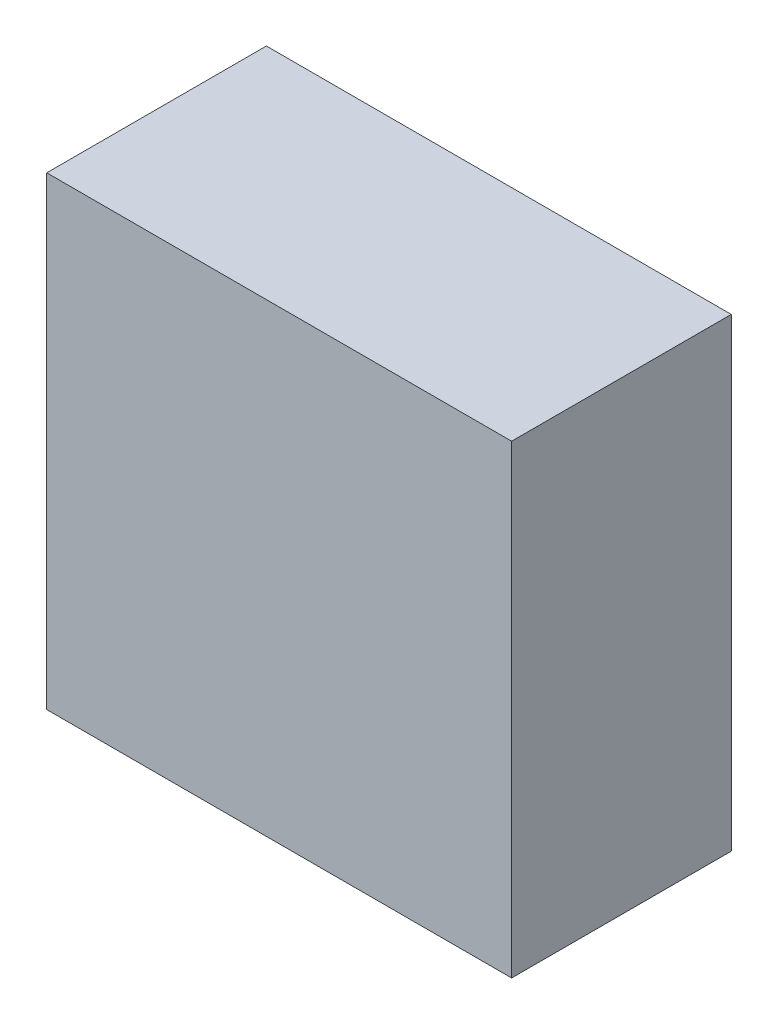
ISO-10303-21;
HEADER;
FILE_DESCRIPTION(('STEP AP214'),'2;1');
FILE_NAME('part.step','',(''),(''),'','','');
FILE_SCHEMA(('AUTOMOTIVE_DESIGN { 1 0 10303 214 1 1 1 1 }'));
ENDSEC;
DATA;
#1=APPLICATION_CONTEXT('core data for automotive mechanical design processes');
#2=APPLICATION_PROTOCOL_DEFINITION('international standard','automotive_design',2000,#1);
#3=PRODUCT_CONTEXT('',#1,'mechanical');
#4=PRODUCT('Part','Part','',(#3));
#5=PRODUCT_RELATED_PRODUCT_CATEGORY('part','',(#4));
#6=PRODUCT_DEFINITION_FORMATION('','',#4);
#7=PRODUCT_DEFINITION_CONTEXT('part definition',#1,'design');
#8=PRODUCT_DEFINITION('design','',#6,#7);
#9=PRODUCT_DEFINITION_SHAPE('','',#8);
#10=(LENGTH_UNIT() NAMED_UNIT(*) SI_UNIT(.MILLI.,.METRE.));
#11=(NAMED_UNIT(*) PLANE_ANGLE_UNIT() SI_UNIT($,.RADIAN.));
#12=(NAMED_UNIT(*) SI_UNIT($,.STERADIAN.) SOLID_ANGLE_UNIT());
#13=UNCERTAINTY_MEASURE_WITH_UNIT(LENGTH_MEASURE(1.E-05),#10,'distance_accuracy_value','');
#14=(GEOMETRIC_REPRESENTATION_CONTEXT(3) GLOBAL_UNCERTAINTY_ASSIGNED_CONTEXT((#13)) GLOBAL_UNIT_ASSIGNED_CONTEXT((#10,
#11,#12)) REPRESENTATION_CONTEXT('',''));
#15=CARTESIAN_POINT('',(0.,0.,0.));
#16=DIRECTION('',(0.,0.,1.));
#17=DIRECTION('',(1.,0.,0.));
#18=AXIS2_PLACEMENT_3D('',#15,#16,#17);
#19=CARTESIAN_POINT('',(-6.35,6.35,6.));
#20=DIRECTION('',(1.,0.,0.));
#21=DIRECTION('',(0.,1.,0.));
#22=AXIS2_PLACEMENT_3D('',#19,#20,#21);
#23=PLANE('',#22);
#24=DIRECTION('',(0.,-1.,0.));
#25=VECTOR('',#24,1.);
#26=CARTESIAN_POINT('',(-6.35,6.35,0.));
#27=LINE('',#26,#25);
#28=CARTESIAN_POINT('',(-6.35,6.35,0.));
#29=VERTEX_POINT('',#28);
#30=CARTESIAN_POINT('',(-6.35,-6.35,0.));
#31=VERTEX_POINT('',#30);
#32=EDGE_CURVE('E93',#29,#31,#27,.T.);
#33=ORIENTED_EDGE('',*,*,#32,.T.);
#34=DIRECTION('',(0.,0.,-1.));
#35=VECTOR('',#34,1.);
#36=CARTESIAN_POINT('',(-6.35,-6.35,6.));
#37=LINE('',#36,#35);
#38=CARTESIAN_POINT('',(-6.35,-6.35,6.));
#39=VERTEX_POINT('',#38);
#40=EDGE_CURVE('E11',#39,#31,#37,.T.);
#41=ORIENTED_EDGE('',*,*,#40,.F.);
#42=DIRECTION('',(0.,-1.,0.));
#43=VECTOR('',#42,1.);
#44=CARTESIAN_POINT('',(-6.35,6.35,6.));
#45=LINE('',#44,#43);
#46=CARTESIAN_POINT('',(-6.35,6.35,6.));
#47=VERTEX_POINT('',#46);
#48=EDGE_CURVE('E102',#47,#39,#45,.T.);
#49=ORIENTED_EDGE('',*,*,#48,.F.);
#50=DIRECTION('',(0.,0.,-1.));
#51=VECTOR('',#50,1.);
#52=CARTESIAN_POINT('',(-6.35,6.35,6.));
#53=LINE('',#52,#51);
#54=EDGE_CURVE('E107',#47,#29,#53,.T.);
#55=ORIENTED_EDGE('',*,*,#54,.T.);
#56=EDGE_LOOP('',(#33,#41,#49,#55));
#57=FACE_BOUND('',#56,.T.);
#58=ADVANCED_FACE('F32',(#57),#23,.F.);
#59=CARTESIAN_POINT('',(-6.35,-6.35,6.));
#60=DIRECTION('',(0.,1.,0.));
#61=DIRECTION('',(-1.,0.,0.));
#62=AXIS2_PLACEMENT_3D('',#59,#60,#61);
#63=PLANE('',#62);
#64=DIRECTION('',(1.,0.,0.));
#65=VECTOR('',#64,1.);
#66=CARTESIAN_POINT('',(-6.35,-6.35,0.));
#67=LINE('',#66,#65);
#68=CARTESIAN_POINT('',(6.35,-6.35,0.));
#69=VERTEX_POINT('',#68);
#70=EDGE_CURVE('E97',#31,#69,#67,.T.);
#71=ORIENTED_EDGE('',*,*,#70,.T.);
#72=DIRECTION('',(0.,0.,-1.));
#73=VECTOR('',#72,1.);
#74=CARTESIAN_POINT('',(6.35,-6.35,6.));
#75=LINE('',#74,#73);
#76=CARTESIAN_POINT('',(6.35,-6.35,6.));
#77=VERTEX_POINT('',#76);
#78=EDGE_CURVE('E40',#77,#69,#75,.T.);
#79=ORIENTED_EDGE('',*,*,#78,.F.);
#80=DIRECTION('',(1.,0.,0.));
#81=VECTOR('',#80,1.);
#82=CARTESIAN_POINT('',(-6.35,-6.35,6.));
#83=LINE('',#82,#81);
#84=EDGE_CURVE('E79',#39,#77,#83,.T.);
#85=ORIENTED_EDGE('',*,*,#84,.F.);
#86=ORIENTED_EDGE('',*,*,#40,.T.);
#87=EDGE_LOOP('',(#71,#79,#85,#86));
#88=FACE_BOUND('',#87,.T.);
#89=ADVANCED_FACE('F130',(#88),#63,.F.);
#90=CARTESIAN_POINT('',(6.35,6.35,6.));
#91=DIRECTION('',(-1.,0.,0.));
#92=DIRECTION('',(0.,-1.,0.));
#93=AXIS2_PLACEMENT_3D('',#90,#91,#92);
#94=PLANE('',#93);
#95=DIRECTION('',(0.,1.,0.));
#96=VECTOR('',#95,1.);
#97=CARTESIAN_POINT('',(6.35,6.35,0.));
#98=LINE('',#97,#96);
#99=CARTESIAN_POINT('',(6.35,6.35,0.));
#100=VERTEX_POINT('',#99);
#101=EDGE_CURVE('E66',#69,#100,#98,.T.);
#102=ORIENTED_EDGE('',*,*,#101,.T.);
#103=DIRECTION('',(0.,0.,-1.));
#104=VECTOR('',#103,1.);
#105=CARTESIAN_POINT('',(6.35,6.35,6.));
#106=LINE('',#105,#104);
#107=CARTESIAN_POINT('',(6.35,6.35,6.));
#108=VERTEX_POINT('',#107);
#109=EDGE_CURVE('E113',#108,#100,#106,.T.);
#110=ORIENTED_EDGE('',*,*,#109,.F.);
#111=DIRECTION('',(0.,1.,0.));
#112=VECTOR('',#111,1.);
#113=CARTESIAN_POINT('',(6.35,6.35,6.));
#114=LINE('',#113,#112);
#115=EDGE_CURVE('E105',#77,#108,#114,.T.);
#116=ORIENTED_EDGE('',*,*,#115,.F.);
#117=ORIENTED_EDGE('',*,*,#78,.T.);
#118=EDGE_LOOP('',(#102,#110,#116,#117));
#119=FACE_BOUND('',#118,.T.);
#120=ADVANCED_FACE('F115',(#119),#94,.F.);
#121=CARTESIAN_POINT('',(-6.35,6.35,6.));
#122=DIRECTION('',(0.,-1.,0.));
#123=DIRECTION('',(0.,0.,-1.));
#124=AXIS2_PLACEMENT_3D('',#121,#122,#123);
#125=PLANE('',#124);
#126=DIRECTION('',(-1.,0.,0.));
#127=VECTOR('',#126,1.);
#128=CARTESIAN_POINT('',(-6.35,6.35,0.));
#129=LINE('',#128,#127);
#130=EDGE_CURVE('E72',#100,#29,#129,.T.);
#131=ORIENTED_EDGE('',*,*,#130,.T.);
#132=ORIENTED_EDGE('',*,*,#54,.F.);
#133=DIRECTION('',(-1.,0.,0.));
#134=VECTOR('',#133,1.);
#135=CARTESIAN_POINT('',(-6.35,6.35,6.));
#136=LINE('',#135,#134);
#137=EDGE_CURVE('E48',#108,#47,#136,.T.);
#138=ORIENTED_EDGE('',*,*,#137,.F.);
#139=ORIENTED_EDGE('',*,*,#109,.T.);
#140=EDGE_LOOP('',(#131,#132,#138,#139));
#141=FACE_BOUND('',#140,.T.);
#142=ADVANCED_FACE('F121',(#141),#125,.F.);
#143=CARTESIAN_POINT('',(0.,0.,6.));
#144=DIRECTION('',(0.,0.,1.));
#145=DIRECTION('',(1.,0.,0.));
#146=AXIS2_PLACEMENT_3D('',#143,#144,#145);
#147=PLANE('',#146);
#148=ORIENTED_EDGE('',*,*,#48,.T.);
#149=ORIENTED_EDGE('',*,*,#84,.T.);
#150=ORIENTED_EDGE('',*,*,#115,.T.);
#151=ORIENTED_EDGE('',*,*,#137,.T.);
#152=EDGE_LOOP('',(#148,#149,#150,#151));
#153=FACE_BOUND('',#152,.T.);
#154=ADVANCED_FACE('F123',(#153),#147,.T.);
#155=CARTESIAN_POINT('',(0.,0.,0.));
#156=DIRECTION('',(0.,0.,1.));
#157=DIRECTION('',(1.,0.,0.));
#158=AXIS2_PLACEMENT_3D('',#155,#156,#157);
#159=PLANE('',#158);
#160=CARTESIAN_POINT('',(0.,0.,0.));
#161=DIRECTION('',(0.,0.,-1.));
#162=DIRECTION('',(-1.,0.,0.));
#163=AXIS2_PLACEMENT_3D('',#160,#161,#162);
#164=CIRCLE('',#163,1.24999999999999);
#165=CARTESIAN_POINT('',(-1.24999999999999,0.,0.));
#166=VERTEX_POINT('',#165);
#167=EDGE_CURVE('E94',#166,#166,#164,.T.);
#168=ORIENTED_EDGE('',*,*,#167,.F.);
#169=EDGE_LOOP('',(#168));
#170=FACE_BOUND('',#169,.T.);
#171=ORIENTED_EDGE('',*,*,#32,.F.);
#172=ORIENTED_EDGE('',*,*,#130,.F.);
#173=ORIENTED_EDGE('',*,*,#101,.F.);
#174=ORIENTED_EDGE('',*,*,#70,.F.);
#175=EDGE_LOOP('',(#171,#172,#173,#174));
#176=FACE_BOUND('',#175,.T.);
#177=ADVANCED_FACE('F87',(#170,#176),#159,.F.);
#178=CARTESIAN_POINT('',(0.,0.,4.));
#179=DIRECTION('',(0.,0.,-1.));
#180=DIRECTION('',(-1.,0.,0.));
#181=AXIS2_PLACEMENT_3D('',#178,#179,#180);
#182=CONICAL_SURFACE('',#181,1.25,1.02974425867665);
#183=CARTESIAN_POINT('',(0.,0.,4.75107577378445));
#184=VERTEX_POINT('',#183);
#185=VERTEX_LOOP('',#184);
#186=FACE_BOUND('',#185,.T.);
#187=CARTESIAN_POINT('',(0.,0.,4.));
#188=DIRECTION('',(0.,0.,-1.));
#189=DIRECTION('',(-1.,0.,0.));
#190=AXIS2_PLACEMENT_3D('',#187,#188,#189);
#191=CIRCLE('',#190,1.25);
#192=CARTESIAN_POINT('',(-1.25,0.,4.));
#193=VERTEX_POINT('',#192);
#194=EDGE_CURVE('E91',#193,#193,#191,.T.);
#195=ORIENTED_EDGE('',*,*,#194,.T.);
#196=EDGE_LOOP('',(#195));
#197=FACE_BOUND('',#196,.T.);
#198=ADVANCED_FACE('F83',(#186,#197),#182,.F.);
#199=CARTESIAN_POINT('',(0.,0.,0.));
#200=DIRECTION('',(0.,0.,-1.));
#201=DIRECTION('',(-1.,0.,0.));
#202=AXIS2_PLACEMENT_3D('',#199,#200,#201);
#203=CYLINDRICAL_SURFACE('',#202,1.24999999999999);
#204=ORIENTED_EDGE('',*,*,#194,.F.);
#205=EDGE_LOOP('',(#204));
#206=FACE_BOUND('',#205,.T.);
#207=ORIENTED_EDGE('',*,*,#167,.T.);
#208=EDGE_LOOP('',(#207));
#209=FACE_BOUND('',#208,.T.);
#210=ADVANCED_FACE('F86',(#206,#209),#203,.F.);
#211=CLOSED_SHELL('',(#58,#89,#120,#142,#154,#177,#198,#210));
#212=MANIFOLD_SOLID_BREP('B2',#211);
#213=ADVANCED_BREP_SHAPE_REPRESENTATION('',(#18,#212),#14);
#214=SHAPE_DEFINITION_REPRESENTATION(#9,#213);
ENDSEC;
END-ISO-10303-21;
